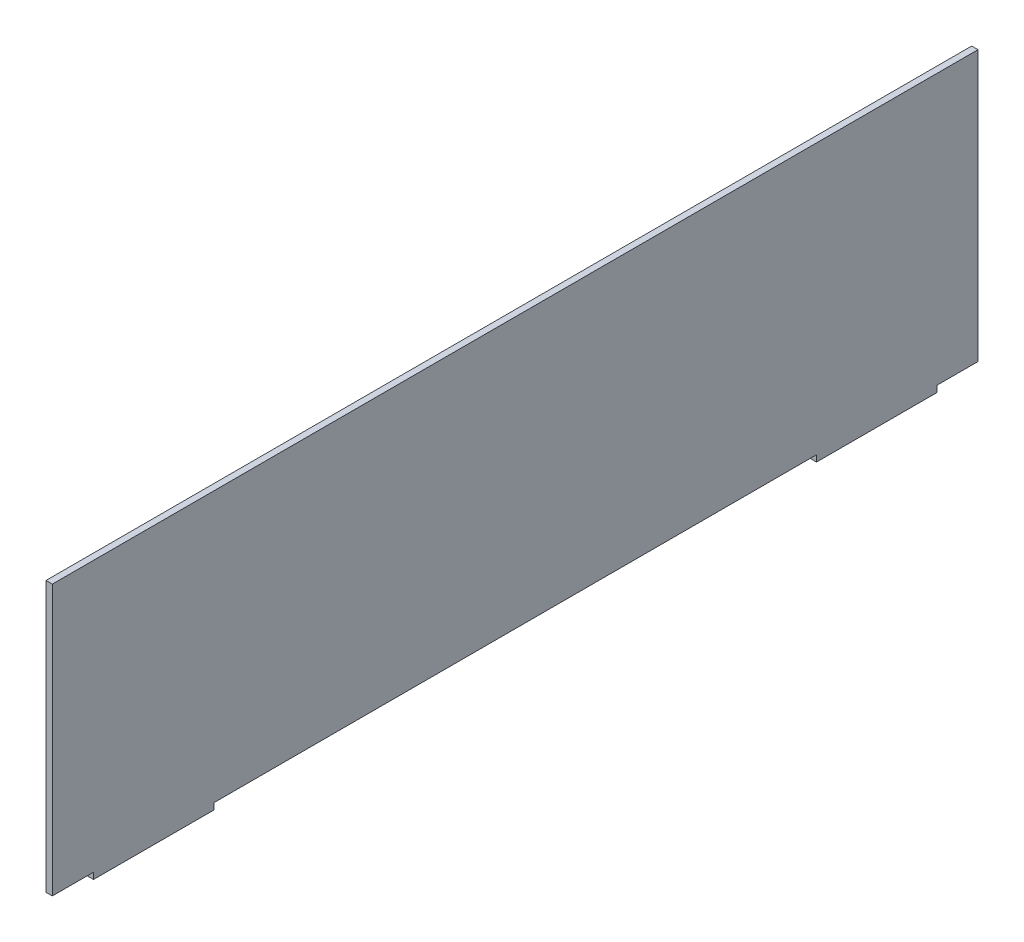
ISO-10303-21;
HEADER;
FILE_DESCRIPTION(('STEP AP214'),'2;1');
FILE_NAME('part.step','',(''),(''),'','','');
FILE_SCHEMA(('AUTOMOTIVE_DESIGN { 1 0 10303 214 1 1 1 1 }'));
ENDSEC;
DATA;
#1=APPLICATION_CONTEXT('core data for automotive mechanical design processes');
#2=APPLICATION_PROTOCOL_DEFINITION('international standard','automotive_design',2000,#1);
#3=PRODUCT_CONTEXT('',#1,'mechanical');
#4=PRODUCT('Part','Part','',(#3));
#5=PRODUCT_RELATED_PRODUCT_CATEGORY('part','',(#4));
#6=PRODUCT_DEFINITION_FORMATION('','',#4);
#7=PRODUCT_DEFINITION_CONTEXT('part definition',#1,'design');
#8=PRODUCT_DEFINITION('design','',#6,#7);
#9=PRODUCT_DEFINITION_SHAPE('','',#8);
#10=(LENGTH_UNIT() NAMED_UNIT(*) SI_UNIT(.MILLI.,.METRE.));
#11=(NAMED_UNIT(*) PLANE_ANGLE_UNIT() SI_UNIT($,.RADIAN.));
#12=(NAMED_UNIT(*) SI_UNIT($,.STERADIAN.) SOLID_ANGLE_UNIT());
#13=UNCERTAINTY_MEASURE_WITH_UNIT(LENGTH_MEASURE(1.E-05),#10,'distance_accuracy_value','');
#14=(GEOMETRIC_REPRESENTATION_CONTEXT(3) GLOBAL_UNCERTAINTY_ASSIGNED_CONTEXT((#13)) GLOBAL_UNIT_ASSIGNED_CONTEXT((#10,
#11,#12)) REPRESENTATION_CONTEXT('',''));
#15=CARTESIAN_POINT('',(0.,0.,0.));
#16=DIRECTION('',(0.,0.,1.));
#17=DIRECTION('',(1.,0.,0.));
#18=AXIS2_PLACEMENT_3D('',#15,#16,#17);
#19=CARTESIAN_POINT('',(-3.175,-67.72275,232.0925));
#20=DIRECTION('',(0.,-1.,0.));
#21=DIRECTION('',(0.,0.,-1.));
#22=AXIS2_PLACEMENT_3D('',#19,#20,#21);
#23=PLANE('',#22);
#24=DIRECTION('',(1.,0.,0.));
#25=VECTOR('',#24,1.);
#26=CARTESIAN_POINT('',(-3.175,-67.72275,-151.13));
#27=LINE('',#26,#25);
#28=CARTESIAN_POINT('',(-3.175,-67.72275,-151.13));
#29=VERTEX_POINT('',#28);
#30=CARTESIAN_POINT('',(0.,-67.72275,-151.13));
#31=VERTEX_POINT('',#30);
#32=EDGE_CURVE('E159',#29,#31,#27,.T.);
#33=ORIENTED_EDGE('',*,*,#32,.T.);
#34=DIRECTION('',(0.,0.,-1.));
#35=VECTOR('',#34,1.);
#36=CARTESIAN_POINT('',(0.,-67.72275,232.0925));
#37=LINE('',#36,#35);
#38=CARTESIAN_POINT('',(0.,-67.72275,151.13));
#39=VERTEX_POINT('',#38);
#40=EDGE_CURVE('E211',#39,#31,#37,.T.);
#41=ORIENTED_EDGE('',*,*,#40,.F.);
#42=DIRECTION('',(1.,0.,0.));
#43=VECTOR('',#42,1.);
#44=CARTESIAN_POINT('',(-3.175,-67.72275,151.13));
#45=LINE('',#44,#43);
#46=CARTESIAN_POINT('',(-3.175,-67.72275,151.13));
#47=VERTEX_POINT('',#46);
#48=EDGE_CURVE('E179',#47,#39,#45,.T.);
#49=ORIENTED_EDGE('',*,*,#48,.F.);
#50=DIRECTION('',(0.,0.,-1.));
#51=VECTOR('',#50,1.);
#52=CARTESIAN_POINT('',(-3.175,-67.72275,232.0925));
#53=LINE('',#52,#51);
#54=EDGE_CURVE('E200',#47,#29,#53,.T.);
#55=ORIENTED_EDGE('',*,*,#54,.T.);
#56=EDGE_LOOP('',(#33,#41,#49,#55));
#57=FACE_BOUND('',#56,.T.);
#58=ADVANCED_FACE('F36',(#57),#23,.T.);
#59=CARTESIAN_POINT('',(-3.175,-67.72275,232.0925));
#60=VERTEX_POINT('',#59);
#61=CARTESIAN_POINT('',(-3.175,-67.72275,211.455));
#62=VERTEX_POINT('',#61);
#63=EDGE_CURVE('E197',#60,#62,#53,.T.);
#64=ORIENTED_EDGE('',*,*,#63,.T.);
#65=DIRECTION('',(1.,0.,0.));
#66=VECTOR('',#65,1.);
#67=CARTESIAN_POINT('',(-3.175,-67.72275,211.455));
#68=LINE('',#67,#66);
#69=CARTESIAN_POINT('',(0.,-67.72275,211.455));
#70=VERTEX_POINT('',#69);
#71=EDGE_CURVE('E172',#62,#70,#68,.T.);
#72=ORIENTED_EDGE('',*,*,#71,.T.);
#73=CARTESIAN_POINT('',(0.,-67.72275,232.0925));
#74=VERTEX_POINT('',#73);
#75=EDGE_CURVE('E191',#74,#70,#37,.T.);
#76=ORIENTED_EDGE('',*,*,#75,.F.);
#77=DIRECTION('',(1.,0.,0.));
#78=VECTOR('',#77,1.);
#79=CARTESIAN_POINT('',(-3.175,-67.72275,232.0925));
#80=LINE('',#79,#78);
#81=EDGE_CURVE('E45',#60,#74,#80,.T.);
#82=ORIENTED_EDGE('',*,*,#81,.F.);
#83=EDGE_LOOP('',(#64,#72,#76,#82));
#84=FACE_BOUND('',#83,.T.);
#85=ADVANCED_FACE('F233',(#84),#23,.T.);
#86=CARTESIAN_POINT('',(-3.175,67.72275,-232.0925));
#87=DIRECTION('',(0.,0.,-1.));
#88=DIRECTION('',(0.,1.,0.));
#89=AXIS2_PLACEMENT_3D('',#86,#87,#88);
#90=PLANE('',#89);
#91=DIRECTION('',(0.,1.,0.));
#92=VECTOR('',#91,1.);
#93=CARTESIAN_POINT('',(0.,67.72275,-232.0925));
#94=LINE('',#93,#92);
#95=CARTESIAN_POINT('',(0.,-67.72275,-232.0925));
#96=VERTEX_POINT('',#95);
#97=CARTESIAN_POINT('',(0.,67.72275,-232.0925));
#98=VERTEX_POINT('',#97);
#99=EDGE_CURVE('E181',#96,#98,#94,.T.);
#100=ORIENTED_EDGE('',*,*,#99,.F.);
#101=DIRECTION('',(1.,0.,0.));
#102=VECTOR('',#101,1.);
#103=CARTESIAN_POINT('',(-3.175,-67.72275,-232.0925));
#104=LINE('',#103,#102);
#105=CARTESIAN_POINT('',(-3.175,-67.72275,-232.0925));
#106=VERTEX_POINT('',#105);
#107=EDGE_CURVE('E11',#106,#96,#104,.T.);
#108=ORIENTED_EDGE('',*,*,#107,.F.);
#109=DIRECTION('',(0.,1.,0.));
#110=VECTOR('',#109,1.);
#111=CARTESIAN_POINT('',(-3.175,67.72275,-232.0925));
#112=LINE('',#111,#110);
#113=CARTESIAN_POINT('',(-3.175,67.72275,-232.0925));
#114=VERTEX_POINT('',#113);
#115=EDGE_CURVE('E187',#106,#114,#112,.T.);
#116=ORIENTED_EDGE('',*,*,#115,.T.);
#117=DIRECTION('',(1.,0.,0.));
#118=VECTOR('',#117,1.);
#119=CARTESIAN_POINT('',(-3.175,67.72275,-232.0925));
#120=LINE('',#119,#118);
#121=EDGE_CURVE('E40',#114,#98,#120,.T.);
#122=ORIENTED_EDGE('',*,*,#121,.T.);
#123=EDGE_LOOP('',(#100,#108,#116,#122));
#124=FACE_BOUND('',#123,.T.);
#125=ADVANCED_FACE('F38',(#124),#90,.T.);
#126=DIRECTION('',(1.,0.,0.));
#127=VECTOR('',#126,1.);
#128=CARTESIAN_POINT('',(-3.175,-67.72275,-211.455));
#129=LINE('',#128,#127);
#130=CARTESIAN_POINT('',(-3.175,-67.72275,-211.455));
#131=VERTEX_POINT('',#130);
#132=CARTESIAN_POINT('',(0.,-67.72275,-211.455));
#133=VERTEX_POINT('',#132);
#134=EDGE_CURVE('E134',#131,#133,#129,.T.);
#135=ORIENTED_EDGE('',*,*,#134,.F.);
#136=EDGE_CURVE('E145',#131,#106,#53,.T.);
#137=ORIENTED_EDGE('',*,*,#136,.T.);
#138=ORIENTED_EDGE('',*,*,#107,.T.);
#139=EDGE_CURVE('E209',#133,#96,#37,.T.);
#140=ORIENTED_EDGE('',*,*,#139,.F.);
#141=EDGE_LOOP('',(#135,#137,#138,#140));
#142=FACE_BOUND('',#141,.T.);
#143=ADVANCED_FACE('F225',(#142),#23,.T.);
#144=CARTESIAN_POINT('',(-3.175,67.72275,232.0925));
#145=DIRECTION('',(0.,0.,1.));
#146=DIRECTION('',(0.,-1.,0.));
#147=AXIS2_PLACEMENT_3D('',#144,#145,#146);
#148=PLANE('',#147);
#149=DIRECTION('',(0.,-1.,0.));
#150=VECTOR('',#149,1.);
#151=CARTESIAN_POINT('',(0.,67.72275,232.0925));
#152=LINE('',#151,#150);
#153=CARTESIAN_POINT('',(0.,67.72275,232.0925));
#154=VERTEX_POINT('',#153);
#155=EDGE_CURVE('E206',#154,#74,#152,.T.);
#156=ORIENTED_EDGE('',*,*,#155,.F.);
#157=DIRECTION('',(1.,0.,0.));
#158=VECTOR('',#157,1.);
#159=CARTESIAN_POINT('',(-3.175,67.72275,232.0925));
#160=LINE('',#159,#158);
#161=CARTESIAN_POINT('',(-3.175,67.72275,232.0925));
#162=VERTEX_POINT('',#161);
#163=EDGE_CURVE('E213',#162,#154,#160,.T.);
#164=ORIENTED_EDGE('',*,*,#163,.F.);
#165=DIRECTION('',(0.,-1.,0.));
#166=VECTOR('',#165,1.);
#167=CARTESIAN_POINT('',(-3.175,67.72275,232.0925));
#168=LINE('',#167,#166);
#169=EDGE_CURVE('E194',#162,#60,#168,.T.);
#170=ORIENTED_EDGE('',*,*,#169,.T.);
#171=ORIENTED_EDGE('',*,*,#81,.T.);
#172=EDGE_LOOP('',(#156,#164,#170,#171));
#173=FACE_BOUND('',#172,.T.);
#174=ADVANCED_FACE('F230',(#173),#148,.T.);
#175=CARTESIAN_POINT('',(-3.175,67.72275,232.0925));
#176=DIRECTION('',(0.,1.,0.));
#177=DIRECTION('',(0.,0.,1.));
#178=AXIS2_PLACEMENT_3D('',#175,#176,#177);
#179=PLANE('',#178);
#180=DIRECTION('',(0.,0.,1.));
#181=VECTOR('',#180,1.);
#182=CARTESIAN_POINT('',(0.,67.72275,232.0925));
#183=LINE('',#182,#181);
#184=EDGE_CURVE('E203',#98,#154,#183,.T.);
#185=ORIENTED_EDGE('',*,*,#184,.F.);
#186=ORIENTED_EDGE('',*,*,#121,.F.);
#187=DIRECTION('',(0.,0.,1.));
#188=VECTOR('',#187,1.);
#189=CARTESIAN_POINT('',(-3.175,67.72275,232.0925));
#190=LINE('',#189,#188);
#191=EDGE_CURVE('E190',#114,#162,#190,.T.);
#192=ORIENTED_EDGE('',*,*,#191,.T.);
#193=ORIENTED_EDGE('',*,*,#163,.T.);
#194=EDGE_LOOP('',(#185,#186,#192,#193));
#195=FACE_BOUND('',#194,.T.);
#196=ADVANCED_FACE('F221',(#195),#179,.T.);
#197=CARTESIAN_POINT('',(-3.175,0.,0.));
#198=DIRECTION('',(1.,0.,0.));
#199=DIRECTION('',(0.,0.,-1.));
#200=AXIS2_PLACEMENT_3D('',#197,#198,#199);
#201=PLANE('',#200);
#202=ORIENTED_EDGE('',*,*,#115,.F.);
#203=ORIENTED_EDGE('',*,*,#136,.F.);
#204=DIRECTION('',(0.,1.,0.));
#205=VECTOR('',#204,1.);
#206=CARTESIAN_POINT('',(-3.175,-67.72275,-211.455));
#207=LINE('',#206,#205);
#208=CARTESIAN_POINT('',(-3.175,-70.89775,-211.455));
#209=VERTEX_POINT('',#208);
#210=EDGE_CURVE('E129',#209,#131,#207,.T.);
#211=ORIENTED_EDGE('',*,*,#210,.F.);
#212=DIRECTION('',(0.,0.,-1.));
#213=VECTOR('',#212,1.);
#214=CARTESIAN_POINT('',(-3.175,-70.89775,-211.455));
#215=LINE('',#214,#213);
#216=CARTESIAN_POINT('',(-3.175,-70.89775,-151.13));
#217=VERTEX_POINT('',#216);
#218=EDGE_CURVE('E143',#217,#209,#215,.T.);
#219=ORIENTED_EDGE('',*,*,#218,.F.);
#220=DIRECTION('',(0.,-1.,0.));
#221=VECTOR('',#220,1.);
#222=CARTESIAN_POINT('',(-3.175,-70.89775,-151.13));
#223=LINE('',#222,#221);
#224=EDGE_CURVE('E135',#29,#217,#223,.T.);
#225=ORIENTED_EDGE('',*,*,#224,.F.);
#226=ORIENTED_EDGE('',*,*,#54,.F.);
#227=DIRECTION('',(0.,1.,0.));
#228=VECTOR('',#227,1.);
#229=CARTESIAN_POINT('',(-3.175,-70.89775,151.13));
#230=LINE('',#229,#228);
#231=CARTESIAN_POINT('',(-3.175,-70.89775,151.13));
#232=VERTEX_POINT('',#231);
#233=EDGE_CURVE('E170',#232,#47,#230,.T.);
#234=ORIENTED_EDGE('',*,*,#233,.F.);
#235=DIRECTION('',(0.,0.,-1.));
#236=VECTOR('',#235,1.);
#237=CARTESIAN_POINT('',(-3.175,-70.89775,211.455));
#238=LINE('',#237,#236);
#239=CARTESIAN_POINT('',(-3.175,-70.89775,211.455));
#240=VERTEX_POINT('',#239);
#241=EDGE_CURVE('E166',#240,#232,#238,.T.);
#242=ORIENTED_EDGE('',*,*,#241,.F.);
#243=DIRECTION('',(0.,-1.,0.));
#244=VECTOR('',#243,1.);
#245=CARTESIAN_POINT('',(-3.175,-67.72275,211.455));
#246=LINE('',#245,#244);
#247=EDGE_CURVE('E163',#62,#240,#246,.T.);
#248=ORIENTED_EDGE('',*,*,#247,.F.);
#249=ORIENTED_EDGE('',*,*,#63,.F.);
#250=ORIENTED_EDGE('',*,*,#169,.F.);
#251=ORIENTED_EDGE('',*,*,#191,.F.);
#252=EDGE_LOOP('',(#202,#203,#211,#219,#225,#226,#234,#242,#248,#249,#250,#251));
#253=FACE_BOUND('',#252,.T.);
#254=ADVANCED_FACE('F141',(#253),#201,.F.);
#255=CARTESIAN_POINT('',(0.,0.,0.));
#256=DIRECTION('',(1.,0.,0.));
#257=DIRECTION('',(0.,0.,-1.));
#258=AXIS2_PLACEMENT_3D('',#255,#256,#257);
#259=PLANE('',#258);
#260=ORIENTED_EDGE('',*,*,#99,.T.);
#261=ORIENTED_EDGE('',*,*,#184,.T.);
#262=ORIENTED_EDGE('',*,*,#155,.T.);
#263=ORIENTED_EDGE('',*,*,#75,.T.);
#264=DIRECTION('',(0.,-1.,0.));
#265=VECTOR('',#264,1.);
#266=CARTESIAN_POINT('',(0.,-67.72275,211.455));
#267=LINE('',#266,#265);
#268=CARTESIAN_POINT('',(0.,-70.89775,211.455));
#269=VERTEX_POINT('',#268);
#270=EDGE_CURVE('E61',#70,#269,#267,.T.);
#271=ORIENTED_EDGE('',*,*,#270,.T.);
#272=DIRECTION('',(0.,0.,-1.));
#273=VECTOR('',#272,1.);
#274=CARTESIAN_POINT('',(0.,-70.89775,211.455));
#275=LINE('',#274,#273);
#276=CARTESIAN_POINT('',(0.,-70.89775,151.13));
#277=VERTEX_POINT('',#276);
#278=EDGE_CURVE('E174',#269,#277,#275,.T.);
#279=ORIENTED_EDGE('',*,*,#278,.T.);
#280=DIRECTION('',(0.,1.,0.));
#281=VECTOR('',#280,1.);
#282=CARTESIAN_POINT('',(0.,-70.89775,151.13));
#283=LINE('',#282,#281);
#284=EDGE_CURVE('E167',#277,#39,#283,.T.);
#285=ORIENTED_EDGE('',*,*,#284,.T.);
#286=ORIENTED_EDGE('',*,*,#40,.T.);
#287=DIRECTION('',(0.,-1.,0.));
#288=VECTOR('',#287,1.);
#289=CARTESIAN_POINT('',(0.,-70.89775,-151.13));
#290=LINE('',#289,#288);
#291=CARTESIAN_POINT('',(0.,-70.89775,-151.13));
#292=VERTEX_POINT('',#291);
#293=EDGE_CURVE('E149',#31,#292,#290,.T.);
#294=ORIENTED_EDGE('',*,*,#293,.T.);
#295=DIRECTION('',(0.,0.,-1.));
#296=VECTOR('',#295,1.);
#297=CARTESIAN_POINT('',(0.,-70.89775,-211.455));
#298=LINE('',#297,#296);
#299=CARTESIAN_POINT('',(0.,-70.89775,-211.455));
#300=VERTEX_POINT('',#299);
#301=EDGE_CURVE('E155',#292,#300,#298,.T.);
#302=ORIENTED_EDGE('',*,*,#301,.T.);
#303=DIRECTION('',(0.,1.,0.));
#304=VECTOR('',#303,1.);
#305=CARTESIAN_POINT('',(0.,-67.72275,-211.455));
#306=LINE('',#305,#304);
#307=EDGE_CURVE('E53',#300,#133,#306,.T.);
#308=ORIENTED_EDGE('',*,*,#307,.T.);
#309=ORIENTED_EDGE('',*,*,#139,.T.);
#310=EDGE_LOOP('',(#260,#261,#262,#263,#271,#279,#285,#286,#294,#302,#308,#309));
#311=FACE_BOUND('',#310,.T.);
#312=ADVANCED_FACE('F222',(#311),#259,.T.);
#313=CARTESIAN_POINT('',(-3.175,-70.89775,151.13));
#314=DIRECTION('',(0.,0.,-1.));
#315=DIRECTION('',(0.,1.,0.));
#316=AXIS2_PLACEMENT_3D('',#313,#314,#315);
#317=PLANE('',#316);
#318=ORIENTED_EDGE('',*,*,#284,.F.);
#319=DIRECTION('',(1.,0.,0.));
#320=VECTOR('',#319,1.);
#321=CARTESIAN_POINT('',(-3.175,-70.89775,151.13));
#322=LINE('',#321,#320);
#323=EDGE_CURVE('E182',#232,#277,#322,.T.);
#324=ORIENTED_EDGE('',*,*,#323,.F.);
#325=ORIENTED_EDGE('',*,*,#233,.T.);
#326=ORIENTED_EDGE('',*,*,#48,.T.);
#327=EDGE_LOOP('',(#318,#324,#325,#326));
#328=FACE_BOUND('',#327,.T.);
#329=ADVANCED_FACE('F245',(#328),#317,.T.);
#330=CARTESIAN_POINT('',(-3.175,-70.89775,211.455));
#331=DIRECTION('',(0.,-1.,0.));
#332=DIRECTION('',(0.,0.,-1.));
#333=AXIS2_PLACEMENT_3D('',#330,#331,#332);
#334=PLANE('',#333);
#335=ORIENTED_EDGE('',*,*,#278,.F.);
#336=DIRECTION('',(1.,0.,0.));
#337=VECTOR('',#336,1.);
#338=CARTESIAN_POINT('',(-3.175,-70.89775,211.455));
#339=LINE('',#338,#337);
#340=EDGE_CURVE('E184',#240,#269,#339,.T.);
#341=ORIENTED_EDGE('',*,*,#340,.F.);
#342=ORIENTED_EDGE('',*,*,#241,.T.);
#343=ORIENTED_EDGE('',*,*,#323,.T.);
#344=EDGE_LOOP('',(#335,#341,#342,#343));
#345=FACE_BOUND('',#344,.T.);
#346=ADVANCED_FACE('F240',(#345),#334,.T.);
#347=CARTESIAN_POINT('',(-3.175,-67.72275,211.455));
#348=DIRECTION('',(0.,0.,1.));
#349=DIRECTION('',(1.,0.,0.));
#350=AXIS2_PLACEMENT_3D('',#347,#348,#349);
#351=PLANE('',#350);
#352=ORIENTED_EDGE('',*,*,#270,.F.);
#353=ORIENTED_EDGE('',*,*,#71,.F.);
#354=ORIENTED_EDGE('',*,*,#247,.T.);
#355=ORIENTED_EDGE('',*,*,#340,.T.);
#356=EDGE_LOOP('',(#352,#353,#354,#355));
#357=FACE_BOUND('',#356,.T.);
#358=ADVANCED_FACE('F234',(#357),#351,.T.);
#359=CARTESIAN_POINT('',(-3.175,-70.89775,-211.455));
#360=DIRECTION('',(0.,-1.,0.));
#361=DIRECTION('',(0.,0.,-1.));
#362=AXIS2_PLACEMENT_3D('',#359,#360,#361);
#363=PLANE('',#362);
#364=ORIENTED_EDGE('',*,*,#301,.F.);
#365=DIRECTION('',(1.,0.,0.));
#366=VECTOR('',#365,1.);
#367=CARTESIAN_POINT('',(-3.175,-70.89775,-151.13));
#368=LINE('',#367,#366);
#369=EDGE_CURVE('E148',#217,#292,#368,.T.);
#370=ORIENTED_EDGE('',*,*,#369,.F.);
#371=ORIENTED_EDGE('',*,*,#218,.T.);
#372=DIRECTION('',(1.,0.,0.));
#373=VECTOR('',#372,1.);
#374=CARTESIAN_POINT('',(-3.175,-70.89775,-211.455));
#375=LINE('',#374,#373);
#376=EDGE_CURVE('E126',#209,#300,#375,.T.);
#377=ORIENTED_EDGE('',*,*,#376,.T.);
#378=EDGE_LOOP('',(#364,#370,#371,#377));
#379=FACE_BOUND('',#378,.T.);
#380=ADVANCED_FACE('F147',(#379),#363,.T.);
#381=CARTESIAN_POINT('',(-3.175,-70.89775,-151.13));
#382=DIRECTION('',(0.,0.,1.));
#383=DIRECTION('',(0.,-1.,0.));
#384=AXIS2_PLACEMENT_3D('',#381,#382,#383);
#385=PLANE('',#384);
#386=ORIENTED_EDGE('',*,*,#293,.F.);
#387=ORIENTED_EDGE('',*,*,#32,.F.);
#388=ORIENTED_EDGE('',*,*,#224,.T.);
#389=ORIENTED_EDGE('',*,*,#369,.T.);
#390=EDGE_LOOP('',(#386,#387,#388,#389));
#391=FACE_BOUND('',#390,.T.);
#392=ADVANCED_FACE('F250',(#391),#385,.T.);
#393=CARTESIAN_POINT('',(-3.175,-67.72275,-211.455));
#394=DIRECTION('',(0.,0.,-1.));
#395=DIRECTION('',(-1.,0.,0.));
#396=AXIS2_PLACEMENT_3D('',#393,#394,#395);
#397=PLANE('',#396);
#398=ORIENTED_EDGE('',*,*,#307,.F.);
#399=ORIENTED_EDGE('',*,*,#376,.F.);
#400=ORIENTED_EDGE('',*,*,#210,.T.);
#401=ORIENTED_EDGE('',*,*,#134,.T.);
#402=EDGE_LOOP('',(#398,#399,#400,#401));
#403=FACE_BOUND('',#402,.T.);
#404=ADVANCED_FACE('F128',(#403),#397,.T.);
#405=CLOSED_SHELL('',(#58,#85,#125,#143,#174,#196,#254,#312,#329,#346,#358,#380,#392,#404));
#406=MANIFOLD_SOLID_BREP('B2',#405);
#407=ADVANCED_BREP_SHAPE_REPRESENTATION('',(#18,#406),#14);
#408=SHAPE_DEFINITION_REPRESENTATION(#9,#407);
ENDSEC;
END-ISO-10303-21;
